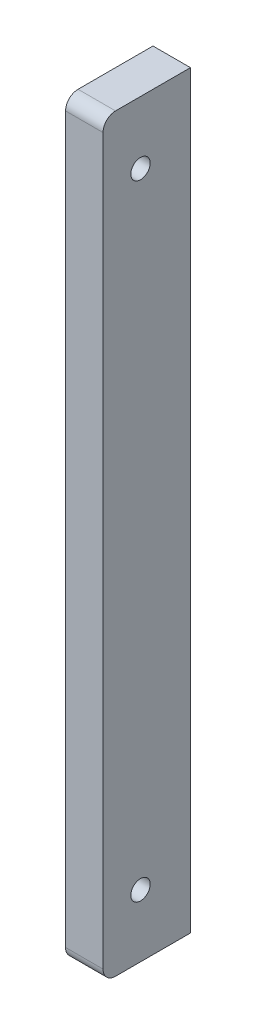
ISO-10303-21;
HEADER;
FILE_DESCRIPTION(('STEP AP214'),'2;1');
FILE_NAME('part.step','',(''),(''),'','','');
FILE_SCHEMA(('AUTOMOTIVE_DESIGN { 1 0 10303 214 1 1 1 1 }'));
ENDSEC;
DATA;
#1=APPLICATION_CONTEXT('core data for automotive mechanical design processes');
#2=APPLICATION_PROTOCOL_DEFINITION('international standard','automotive_design',2000,#1);
#3=PRODUCT_CONTEXT('',#1,'mechanical');
#4=PRODUCT('Part','Part','',(#3));
#5=PRODUCT_RELATED_PRODUCT_CATEGORY('part','',(#4));
#6=PRODUCT_DEFINITION_FORMATION('','',#4);
#7=PRODUCT_DEFINITION_CONTEXT('part definition',#1,'design');
#8=PRODUCT_DEFINITION('design','',#6,#7);
#9=PRODUCT_DEFINITION_SHAPE('','',#8);
#10=(LENGTH_UNIT() NAMED_UNIT(*) SI_UNIT(.MILLI.,.METRE.));
#11=(NAMED_UNIT(*) PLANE_ANGLE_UNIT() SI_UNIT($,.RADIAN.));
#12=(NAMED_UNIT(*) SI_UNIT($,.STERADIAN.) SOLID_ANGLE_UNIT());
#13=UNCERTAINTY_MEASURE_WITH_UNIT(LENGTH_MEASURE(1.E-05),#10,'distance_accuracy_value','');
#14=(GEOMETRIC_REPRESENTATION_CONTEXT(3) GLOBAL_UNCERTAINTY_ASSIGNED_CONTEXT((#13)) GLOBAL_UNIT_ASSIGNED_CONTEXT((#10,
#11,#12)) REPRESENTATION_CONTEXT('',''));
#15=CARTESIAN_POINT('',(0.,0.,0.));
#16=DIRECTION('',(0.,0.,1.));
#17=DIRECTION('',(1.,0.,0.));
#18=AXIS2_PLACEMENT_3D('',#15,#16,#17);
#19=CARTESIAN_POINT('',(6.,0.,0.));
#20=DIRECTION('',(-1.,0.,0.));
#21=DIRECTION('',(0.,0.,1.));
#22=AXIS2_PLACEMENT_3D('',#19,#20,#21);
#23=PLANE('',#22);
#24=DIRECTION('',(0.,-1.,0.));
#25=VECTOR('',#24,1.);
#26=CARTESIAN_POINT('',(6.,-60.,14.));
#27=LINE('',#26,#25);
#28=CARTESIAN_POINT('',(6.,58.,14.));
#29=VERTEX_POINT('',#28);
#30=CARTESIAN_POINT('',(6.,-58.,14.));
#31=VERTEX_POINT('',#30);
#32=EDGE_CURVE('E103',#29,#31,#27,.T.);
#33=ORIENTED_EDGE('',*,*,#32,.T.);
#34=CARTESIAN_POINT('',(6.,-58.,12.));
#35=DIRECTION('',(-1.,0.,0.));
#36=DIRECTION('',(0.,0.,1.));
#37=AXIS2_PLACEMENT_3D('',#34,#35,#36);
#38=CIRCLE('',#37,2.);
#39=CARTESIAN_POINT('',(6.,-60.,12.));
#40=VERTEX_POINT('',#39);
#41=EDGE_CURVE('E50',#31,#40,#38,.F.);
#42=ORIENTED_EDGE('',*,*,#41,.T.);
#43=DIRECTION('',(0.,0.,-1.));
#44=VECTOR('',#43,1.);
#45=CARTESIAN_POINT('',(6.,-60.,14.));
#46=LINE('',#45,#44);
#47=CARTESIAN_POINT('',(6.,-60.,0.));
#48=VERTEX_POINT('',#47);
#49=EDGE_CURVE('E91',#40,#48,#46,.T.);
#50=ORIENTED_EDGE('',*,*,#49,.T.);
#51=DIRECTION('',(0.,1.,0.));
#52=VECTOR('',#51,1.);
#53=CARTESIAN_POINT('',(6.,60.,0.));
#54=LINE('',#53,#52);
#55=CARTESIAN_POINT('',(6.,60.,0.));
#56=VERTEX_POINT('',#55);
#57=EDGE_CURVE('E100',#48,#56,#54,.T.);
#58=ORIENTED_EDGE('',*,*,#57,.T.);
#59=DIRECTION('',(0.,0.,1.));
#60=VECTOR('',#59,1.);
#61=CARTESIAN_POINT('',(6.,60.,14.));
#62=LINE('',#61,#60);
#63=CARTESIAN_POINT('',(6.,60.,12.));
#64=VERTEX_POINT('',#63);
#65=EDGE_CURVE('E126',#56,#64,#62,.T.);
#66=ORIENTED_EDGE('',*,*,#65,.T.);
#67=CARTESIAN_POINT('',(6.,58.,12.));
#68=DIRECTION('',(-1.,0.,0.));
#69=DIRECTION('',(0.,0.,1.));
#70=AXIS2_PLACEMENT_3D('',#67,#68,#69);
#71=CIRCLE('',#70,2.);
#72=EDGE_CURVE('E139',#64,#29,#71,.F.);
#73=ORIENTED_EDGE('',*,*,#72,.T.);
#74=EDGE_LOOP('',(#33,#42,#50,#58,#66,#73));
#75=FACE_BOUND('',#74,.T.);
#76=CARTESIAN_POINT('',(6.,50.,8.));
#77=DIRECTION('',(1.,0.,0.));
#78=DIRECTION('',(0.,0.,-1.));
#79=AXIS2_PLACEMENT_3D('',#76,#77,#78);
#80=CIRCLE('',#79,1.55);
#81=CARTESIAN_POINT('',(6.,50.,6.45));
#82=VERTEX_POINT('',#81);
#83=EDGE_CURVE('E124',#82,#82,#80,.T.);
#84=ORIENTED_EDGE('',*,*,#83,.F.);
#85=EDGE_LOOP('',(#84));
#86=FACE_BOUND('',#85,.T.);
#87=CARTESIAN_POINT('',(6.,-50.,8.));
#88=DIRECTION('',(1.,0.,0.));
#89=DIRECTION('',(0.,0.,1.));
#90=AXIS2_PLACEMENT_3D('',#87,#88,#89);
#91=CIRCLE('',#90,1.55);
#92=CARTESIAN_POINT('',(6.,-50.,9.55));
#93=VERTEX_POINT('',#92);
#94=EDGE_CURVE('E154',#93,#93,#91,.T.);
#95=ORIENTED_EDGE('',*,*,#94,.F.);
#96=EDGE_LOOP('',(#95));
#97=FACE_BOUND('',#96,.T.);
#98=ADVANCED_FACE('F39',(#75,#86,#97),#23,.F.);
#99=CARTESIAN_POINT('',(0.,0.,0.));
#100=DIRECTION('',(-1.,0.,0.));
#101=DIRECTION('',(0.,0.,1.));
#102=AXIS2_PLACEMENT_3D('',#99,#100,#101);
#103=PLANE('',#102);
#104=CARTESIAN_POINT('',(0.,50.,8.));
#105=DIRECTION('',(1.,0.,0.));
#106=DIRECTION('',(0.,0.,-1.));
#107=AXIS2_PLACEMENT_3D('',#104,#105,#106);
#108=CIRCLE('',#107,1.55);
#109=CARTESIAN_POINT('',(0.,50.,6.45));
#110=VERTEX_POINT('',#109);
#111=EDGE_CURVE('E155',#110,#110,#108,.T.);
#112=ORIENTED_EDGE('',*,*,#111,.T.);
#113=EDGE_LOOP('',(#112));
#114=FACE_BOUND('',#113,.T.);
#115=DIRECTION('',(0.,0.,-1.));
#116=VECTOR('',#115,1.);
#117=CARTESIAN_POINT('',(0.,-60.,14.));
#118=LINE('',#117,#116);
#119=CARTESIAN_POINT('',(0.,-60.,12.));
#120=VERTEX_POINT('',#119);
#121=CARTESIAN_POINT('',(0.,-60.,0.));
#122=VERTEX_POINT('',#121);
#123=EDGE_CURVE('E108',#120,#122,#118,.T.);
#124=ORIENTED_EDGE('',*,*,#123,.F.);
#125=CARTESIAN_POINT('',(0.,-58.,12.));
#126=DIRECTION('',(-1.,0.,0.));
#127=DIRECTION('',(0.,0.,1.));
#128=AXIS2_PLACEMENT_3D('',#125,#126,#127);
#129=CIRCLE('',#128,2.);
#130=CARTESIAN_POINT('',(0.,-58.,14.));
#131=VERTEX_POINT('',#130);
#132=EDGE_CURVE('E131',#120,#131,#129,.T.);
#133=ORIENTED_EDGE('',*,*,#132,.T.);
#134=DIRECTION('',(0.,-1.,0.));
#135=VECTOR('',#134,1.);
#136=CARTESIAN_POINT('',(0.,-60.,14.));
#137=LINE('',#136,#135);
#138=CARTESIAN_POINT('',(0.,58.,14.));
#139=VERTEX_POINT('',#138);
#140=EDGE_CURVE('E123',#139,#131,#137,.T.);
#141=ORIENTED_EDGE('',*,*,#140,.F.);
#142=CARTESIAN_POINT('',(0.,58.,12.));
#143=DIRECTION('',(-1.,0.,0.));
#144=DIRECTION('',(0.,0.,1.));
#145=AXIS2_PLACEMENT_3D('',#142,#143,#144);
#146=CIRCLE('',#145,2.);
#147=CARTESIAN_POINT('',(0.,60.,12.));
#148=VERTEX_POINT('',#147);
#149=EDGE_CURVE('E133',#139,#148,#146,.T.);
#150=ORIENTED_EDGE('',*,*,#149,.T.);
#151=DIRECTION('',(0.,0.,1.));
#152=VECTOR('',#151,1.);
#153=CARTESIAN_POINT('',(0.,60.,14.));
#154=LINE('',#153,#152);
#155=CARTESIAN_POINT('',(0.,60.,0.));
#156=VERTEX_POINT('',#155);
#157=EDGE_CURVE('E122',#156,#148,#154,.T.);
#158=ORIENTED_EDGE('',*,*,#157,.F.);
#159=DIRECTION('',(0.,1.,0.));
#160=VECTOR('',#159,1.);
#161=CARTESIAN_POINT('',(0.,60.,0.));
#162=LINE('',#161,#160);
#163=EDGE_CURVE('E130',#122,#156,#162,.T.);
#164=ORIENTED_EDGE('',*,*,#163,.F.);
#165=EDGE_LOOP('',(#124,#133,#141,#150,#158,#164));
#166=FACE_BOUND('',#165,.T.);
#167=CARTESIAN_POINT('',(0.,-50.,8.));
#168=DIRECTION('',(1.,0.,0.));
#169=DIRECTION('',(0.,0.,1.));
#170=AXIS2_PLACEMENT_3D('',#167,#168,#169);
#171=CIRCLE('',#170,1.55);
#172=CARTESIAN_POINT('',(0.,-50.,9.55));
#173=VERTEX_POINT('',#172);
#174=EDGE_CURVE('E158',#173,#173,#171,.T.);
#175=ORIENTED_EDGE('',*,*,#174,.T.);
#176=EDGE_LOOP('',(#175));
#177=FACE_BOUND('',#176,.T.);
#178=ADVANCED_FACE('F150',(#114,#166,#177),#103,.T.);
#179=CARTESIAN_POINT('',(6.,60.,14.));
#180=DIRECTION('',(0.,-1.,0.));
#181=DIRECTION('',(0.,0.,-1.));
#182=AXIS2_PLACEMENT_3D('',#179,#180,#181);
#183=PLANE('',#182);
#184=ORIENTED_EDGE('',*,*,#157,.T.);
#185=DIRECTION('',(-1.,0.,0.));
#186=VECTOR('',#185,1.);
#187=CARTESIAN_POINT('',(6.,60.,12.));
#188=LINE('',#187,#186);
#189=EDGE_CURVE('E11',#148,#64,#188,.F.);
#190=ORIENTED_EDGE('',*,*,#189,.T.);
#191=ORIENTED_EDGE('',*,*,#65,.F.);
#192=DIRECTION('',(-1.,0.,0.));
#193=VECTOR('',#192,1.);
#194=CARTESIAN_POINT('',(6.,60.,0.));
#195=LINE('',#194,#193);
#196=EDGE_CURVE('E114',#56,#156,#195,.T.);
#197=ORIENTED_EDGE('',*,*,#196,.T.);
#198=EDGE_LOOP('',(#184,#190,#191,#197));
#199=FACE_BOUND('',#198,.T.);
#200=ADVANCED_FACE('F149',(#199),#183,.F.);
#201=CARTESIAN_POINT('',(6.,-60.,14.));
#202=DIRECTION('',(0.,0.,-1.));
#203=DIRECTION('',(-1.,0.,0.));
#204=AXIS2_PLACEMENT_3D('',#201,#202,#203);
#205=PLANE('',#204);
#206=ORIENTED_EDGE('',*,*,#140,.T.);
#207=DIRECTION('',(-1.,0.,0.));
#208=VECTOR('',#207,1.);
#209=CARTESIAN_POINT('',(6.,-58.,14.));
#210=LINE('',#209,#208);
#211=EDGE_CURVE('E58',#131,#31,#210,.F.);
#212=ORIENTED_EDGE('',*,*,#211,.T.);
#213=ORIENTED_EDGE('',*,*,#32,.F.);
#214=DIRECTION('',(-1.,0.,0.));
#215=VECTOR('',#214,1.);
#216=CARTESIAN_POINT('',(6.,58.,14.));
#217=LINE('',#216,#215);
#218=EDGE_CURVE('E134',#29,#139,#217,.T.);
#219=ORIENTED_EDGE('',*,*,#218,.T.);
#220=EDGE_LOOP('',(#206,#212,#213,#219));
#221=FACE_BOUND('',#220,.T.);
#222=ADVANCED_FACE('F141',(#221),#205,.F.);
#223=CARTESIAN_POINT('',(6.,-60.,14.));
#224=DIRECTION('',(0.,1.,0.));
#225=DIRECTION('',(0.,0.,1.));
#226=AXIS2_PLACEMENT_3D('',#223,#224,#225);
#227=PLANE('',#226);
#228=ORIENTED_EDGE('',*,*,#49,.F.);
#229=DIRECTION('',(-1.,0.,0.));
#230=VECTOR('',#229,1.);
#231=CARTESIAN_POINT('',(6.,-60.,12.));
#232=LINE('',#231,#230);
#233=EDGE_CURVE('E115',#40,#120,#232,.T.);
#234=ORIENTED_EDGE('',*,*,#233,.T.);
#235=ORIENTED_EDGE('',*,*,#123,.T.);
#236=DIRECTION('',(-1.,0.,0.));
#237=VECTOR('',#236,1.);
#238=CARTESIAN_POINT('',(6.,-60.,0.));
#239=LINE('',#238,#237);
#240=EDGE_CURVE('E106',#48,#122,#239,.T.);
#241=ORIENTED_EDGE('',*,*,#240,.F.);
#242=EDGE_LOOP('',(#228,#234,#235,#241));
#243=FACE_BOUND('',#242,.T.);
#244=ADVANCED_FACE('F110',(#243),#227,.F.);
#245=CARTESIAN_POINT('',(6.,60.,0.));
#246=DIRECTION('',(0.,0.,1.));
#247=DIRECTION('',(1.,0.,0.));
#248=AXIS2_PLACEMENT_3D('',#245,#246,#247);
#249=PLANE('',#248);
#250=ORIENTED_EDGE('',*,*,#163,.T.);
#251=ORIENTED_EDGE('',*,*,#196,.F.);
#252=ORIENTED_EDGE('',*,*,#57,.F.);
#253=ORIENTED_EDGE('',*,*,#240,.T.);
#254=EDGE_LOOP('',(#250,#251,#252,#253));
#255=FACE_BOUND('',#254,.T.);
#256=ADVANCED_FACE('F113',(#255),#249,.F.);
#257=CARTESIAN_POINT('',(6.,50.,8.));
#258=DIRECTION('',(-1.,0.,0.));
#259=DIRECTION('',(0.,0.,1.));
#260=AXIS2_PLACEMENT_3D('',#257,#258,#259);
#261=CYLINDRICAL_SURFACE('',#260,1.55);
#262=ORIENTED_EDGE('',*,*,#83,.T.);
#263=EDGE_LOOP('',(#262));
#264=FACE_BOUND('',#263,.T.);
#265=ORIENTED_EDGE('',*,*,#111,.F.);
#266=EDGE_LOOP('',(#265));
#267=FACE_BOUND('',#266,.T.);
#268=ADVANCED_FACE('F177',(#264,#267),#261,.F.);
#269=CARTESIAN_POINT('',(6.,-50.,8.));
#270=DIRECTION('',(-1.,0.,0.));
#271=DIRECTION('',(0.,0.,1.));
#272=AXIS2_PLACEMENT_3D('',#269,#270,#271);
#273=CYLINDRICAL_SURFACE('',#272,1.55);
#274=ORIENTED_EDGE('',*,*,#94,.T.);
#275=EDGE_LOOP('',(#274));
#276=FACE_BOUND('',#275,.T.);
#277=ORIENTED_EDGE('',*,*,#174,.F.);
#278=EDGE_LOOP('',(#277));
#279=FACE_BOUND('',#278,.T.);
#280=ADVANCED_FACE('F163',(#276,#279),#273,.F.);
#281=CARTESIAN_POINT('',(6.,-58.,12.));
#282=DIRECTION('',(-1.,0.,0.));
#283=DIRECTION('',(0.,0.,1.));
#284=AXIS2_PLACEMENT_3D('',#281,#282,#283);
#285=CYLINDRICAL_SURFACE('',#284,2.);
#286=ORIENTED_EDGE('',*,*,#41,.F.);
#287=ORIENTED_EDGE('',*,*,#211,.F.);
#288=ORIENTED_EDGE('',*,*,#132,.F.);
#289=ORIENTED_EDGE('',*,*,#233,.F.);
#290=EDGE_LOOP('',(#286,#287,#288,#289));
#291=FACE_BOUND('',#290,.T.);
#292=ADVANCED_FACE('F188',(#291),#285,.T.);
#293=CARTESIAN_POINT('',(6.,58.,12.));
#294=DIRECTION('',(-1.,0.,0.));
#295=DIRECTION('',(0.,0.,1.));
#296=AXIS2_PLACEMENT_3D('',#293,#294,#295);
#297=CYLINDRICAL_SURFACE('',#296,2.);
#298=ORIENTED_EDGE('',*,*,#72,.F.);
#299=ORIENTED_EDGE('',*,*,#189,.F.);
#300=ORIENTED_EDGE('',*,*,#149,.F.);
#301=ORIENTED_EDGE('',*,*,#218,.F.);
#302=EDGE_LOOP('',(#298,#299,#300,#301));
#303=FACE_BOUND('',#302,.T.);
#304=ADVANCED_FACE('F41',(#303),#297,.T.);
#305=CLOSED_SHELL('',(#98,#178,#200,#222,#244,#256,#268,#280,#292,#304));
#306=MANIFOLD_SOLID_BREP('B2',#305);
#307=ADVANCED_BREP_SHAPE_REPRESENTATION('',(#18,#306),#14);
#308=SHAPE_DEFINITION_REPRESENTATION(#9,#307);
ENDSEC;
END-ISO-10303-21;
